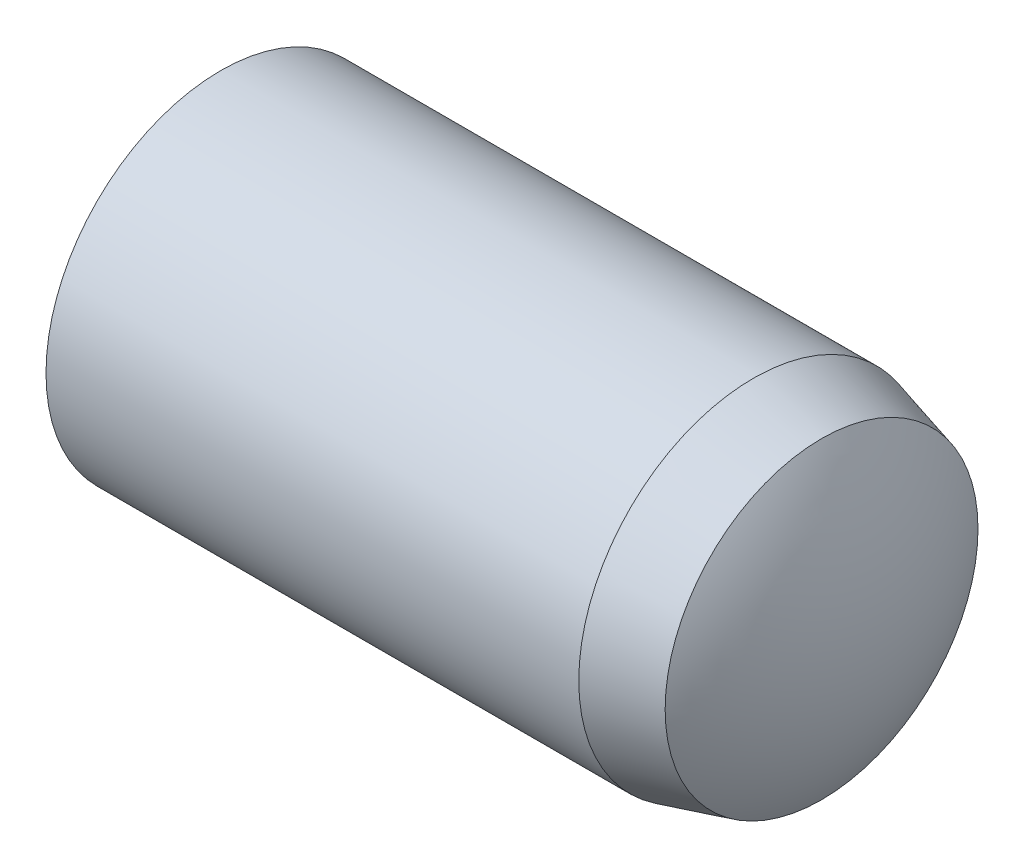
ISO-10303-21;
HEADER;
FILE_DESCRIPTION(('STEP AP214'),'2;1');
FILE_NAME('part.step','',(''),(''),'','','');
FILE_SCHEMA(('AUTOMOTIVE_DESIGN { 1 0 10303 214 1 1 1 1 }'));
ENDSEC;
DATA;
#1=APPLICATION_CONTEXT('core data for automotive mechanical design processes');
#2=APPLICATION_PROTOCOL_DEFINITION('international standard','automotive_design',2000,#1);
#3=PRODUCT_CONTEXT('',#1,'mechanical');
#4=PRODUCT('Part','Part','',(#3));
#5=PRODUCT_RELATED_PRODUCT_CATEGORY('part','',(#4));
#6=PRODUCT_DEFINITION_FORMATION('','',#4);
#7=PRODUCT_DEFINITION_CONTEXT('part definition',#1,'design');
#8=PRODUCT_DEFINITION('design','',#6,#7);
#9=PRODUCT_DEFINITION_SHAPE('','',#8);
#10=(LENGTH_UNIT() NAMED_UNIT(*) SI_UNIT(.MILLI.,.METRE.));
#11=(NAMED_UNIT(*) PLANE_ANGLE_UNIT() SI_UNIT($,.RADIAN.));
#12=(NAMED_UNIT(*) SI_UNIT($,.STERADIAN.) SOLID_ANGLE_UNIT());
#13=UNCERTAINTY_MEASURE_WITH_UNIT(LENGTH_MEASURE(1.E-05),#10,'distance_accuracy_value','');
#14=(GEOMETRIC_REPRESENTATION_CONTEXT(3) GLOBAL_UNCERTAINTY_ASSIGNED_CONTEXT((#13)) GLOBAL_UNIT_ASSIGNED_CONTEXT((#10,
#11,#12)) REPRESENTATION_CONTEXT('',''));
#15=CARTESIAN_POINT('',(0.,0.,0.));
#16=DIRECTION('',(0.,0.,1.));
#17=DIRECTION('',(1.,0.,0.));
#18=AXIS2_PLACEMENT_3D('',#15,#16,#17);
#19=CARTESIAN_POINT('',(-3.,0.,0.));
#20=DIRECTION('',(1.,0.,0.));
#21=DIRECTION('',(0.,0.,-1.));
#22=AXIS2_PLACEMENT_3D('',#19,#20,#21);
#23=CYLINDRICAL_SURFACE('',#22,1.5);
#24=CARTESIAN_POINT('',(2.025,0.,0.));
#25=DIRECTION('',(-1.,0.,0.));
#26=DIRECTION('',(0.,0.,1.));
#27=AXIS2_PLACEMENT_3D('',#24,#25,#26);
#28=CIRCLE('',#27,1.49999999999999);
#29=CARTESIAN_POINT('',(2.025,0.,1.49999999999999));
#30=VERTEX_POINT('',#29);
#31=EDGE_CURVE('E11',#30,#30,#28,.T.);
#32=ORIENTED_EDGE('',*,*,#31,.T.);
#33=EDGE_LOOP('',(#32));
#34=FACE_BOUND('',#33,.T.);
#35=CARTESIAN_POINT('',(-2.55,0.,0.));
#36=DIRECTION('',(-1.,0.,0.));
#37=DIRECTION('',(0.,0.,1.));
#38=AXIS2_PLACEMENT_3D('',#35,#36,#37);
#39=CIRCLE('',#38,1.5);
#40=CARTESIAN_POINT('',(-2.55,0.,1.5));
#41=VERTEX_POINT('',#40);
#42=EDGE_CURVE('E54',#41,#41,#39,.T.);
#43=ORIENTED_EDGE('',*,*,#42,.F.);
#44=EDGE_LOOP('',(#43));
#45=FACE_BOUND('',#44,.T.);
#46=ADVANCED_FACE('F34',(#34,#45),#23,.T.);
#47=CARTESIAN_POINT('',(2.025,0.,0.));
#48=DIRECTION('',(-1.,0.,0.));
#49=DIRECTION('',(0.,0.,1.));
#50=AXIS2_PLACEMENT_3D('',#47,#48,#49);
#51=CONICAL_SURFACE('',#50,1.49999999999999,0.261799387799151);
#52=CARTESIAN_POINT('',(2.61,0.,0.));
#53=DIRECTION('',(-1.,0.,0.));
#54=DIRECTION('',(0.,0.,1.));
#55=AXIS2_PLACEMENT_3D('',#52,#53,#54);
#56=CIRCLE('',#55,1.34324972242779);
#57=CARTESIAN_POINT('',(2.61,0.,1.34324972242779));
#58=VERTEX_POINT('',#57);
#59=EDGE_CURVE('E41',#58,#58,#56,.T.);
#60=ORIENTED_EDGE('',*,*,#59,.T.);
#61=EDGE_LOOP('',(#60));
#62=FACE_BOUND('',#61,.T.);
#63=ORIENTED_EDGE('',*,*,#31,.F.);
#64=EDGE_LOOP('',(#63));
#65=FACE_BOUND('',#64,.T.);
#66=ADVANCED_FACE('F60',(#62,#65),#51,.T.);
#67=CARTESIAN_POINT('',(0.491769465638076,0.,0.));
#68=DIRECTION('',(-1.,0.,0.));
#69=DIRECTION('',(0.,1.,0.));
#70=AXIS2_PLACEMENT_3D('',#67,#68,#69);
#71=SPHERICAL_SURFACE('',#70,2.50823053436193);
#72=CARTESIAN_POINT('',(3.,0.,0.));
#73=VERTEX_POINT('',#72);
#74=VERTEX_LOOP('',#73);
#75=FACE_BOUND('',#74,.T.);
#76=ORIENTED_EDGE('',*,*,#59,.F.);
#77=EDGE_LOOP('',(#76));
#78=FACE_BOUND('',#77,.T.);
#79=ADVANCED_FACE('F50',(#75,#78),#71,.T.);
#80=CARTESIAN_POINT('',(-0.274999999999997,0.,0.));
#81=DIRECTION('',(-1.,0.,0.));
#82=DIRECTION('',(0.,-1.,0.));
#83=AXIS2_PLACEMENT_3D('',#80,#81,#82);
#84=SPHERICAL_SURFACE('',#83,2.725);
#85=CARTESIAN_POINT('',(-3.,0.,0.));
#86=VERTEX_POINT('',#85);
#87=VERTEX_LOOP('',#86);
#88=FACE_BOUND('',#87,.T.);
#89=ORIENTED_EDGE('',*,*,#42,.T.);
#90=EDGE_LOOP('',(#89));
#91=FACE_BOUND('',#90,.T.);
#92=ADVANCED_FACE('F47',(#88,#91),#84,.T.);
#93=CLOSED_SHELL('',(#46,#66,#79,#92));
#94=MANIFOLD_SOLID_BREP('B2',#93);
#95=ADVANCED_BREP_SHAPE_REPRESENTATION('',(#18,#94),#14);
#96=SHAPE_DEFINITION_REPRESENTATION(#9,#95);
ENDSEC;
END-ISO-10303-21;
